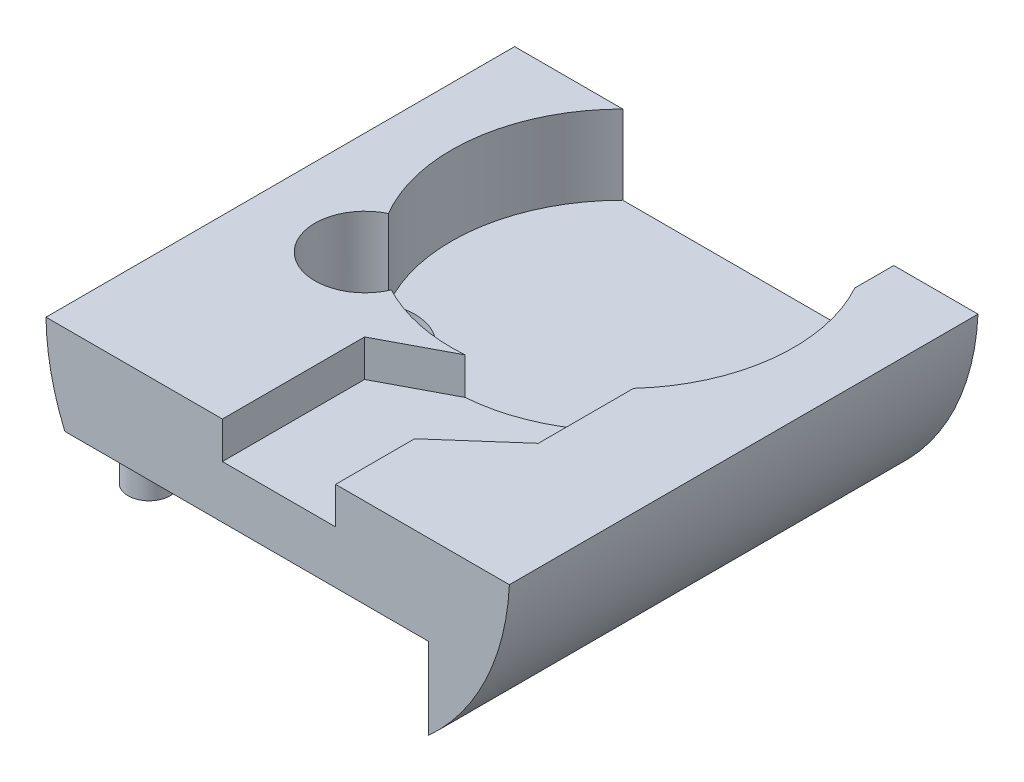
ISO-10303-21;
HEADER;
FILE_DESCRIPTION(('STEP AP214'),'2;1');
FILE_NAME('part.step','',(''),(''),'','','');
FILE_SCHEMA(('AUTOMOTIVE_DESIGN { 1 0 10303 214 1 1 1 1 }'));
ENDSEC;
DATA;
#1=APPLICATION_CONTEXT('core data for automotive mechanical design processes');
#2=APPLICATION_PROTOCOL_DEFINITION('international standard','automotive_design',2000,#1);
#3=PRODUCT_CONTEXT('',#1,'mechanical');
#4=PRODUCT('Part','Part','',(#3));
#5=PRODUCT_RELATED_PRODUCT_CATEGORY('part','',(#4));
#6=PRODUCT_DEFINITION_FORMATION('','',#4);
#7=PRODUCT_DEFINITION_CONTEXT('part definition',#1,'design');
#8=PRODUCT_DEFINITION('design','',#6,#7);
#9=PRODUCT_DEFINITION_SHAPE('','',#8);
#10=(LENGTH_UNIT() NAMED_UNIT(*) SI_UNIT(.MILLI.,.METRE.));
#11=(NAMED_UNIT(*) PLANE_ANGLE_UNIT() SI_UNIT($,.RADIAN.));
#12=(NAMED_UNIT(*) SI_UNIT($,.STERADIAN.) SOLID_ANGLE_UNIT());
#13=UNCERTAINTY_MEASURE_WITH_UNIT(LENGTH_MEASURE(1.E-05),#10,'distance_accuracy_value','');
#14=(GEOMETRIC_REPRESENTATION_CONTEXT(3) GLOBAL_UNCERTAINTY_ASSIGNED_CONTEXT((#13)) GLOBAL_UNIT_ASSIGNED_CONTEXT((#10,
#11,#12)) REPRESENTATION_CONTEXT('',''));
#15=CARTESIAN_POINT('',(0.,0.,0.));
#16=DIRECTION('',(0.,0.,1.));
#17=DIRECTION('',(1.,0.,0.));
#18=AXIS2_PLACEMENT_3D('',#15,#16,#17);
#19=CARTESIAN_POINT('',(0.115173737314581,37.,-24.));
#20=DIRECTION('',(0.,1.,0.));
#21=DIRECTION('',(0.,0.,1.));
#22=AXIS2_PLACEMENT_3D('',#19,#20,#21);
#23=PLANE('',#22);
#24=CARTESIAN_POINT('',(0.115173737314581,37.,-24.));
#25=DIRECTION('',(0.,1.,0.));
#26=DIRECTION('',(0.,0.,1.));
#27=AXIS2_PLACEMENT_3D('',#24,#25,#26);
#28=CIRCLE('',#27,32.5);
#29=CARTESIAN_POINT('',(2.61517373731457,37.,8.40370349203933));
#30=VERTEX_POINT('',#29);
#31=CARTESIAN_POINT('',(24.1151737373146,37.,-2.08539299918885));
#32=VERTEX_POINT('',#31);
#33=EDGE_CURVE('E166',#30,#32,#28,.T.);
#34=ORIENTED_EDGE('',*,*,#33,.F.);
#35=DIRECTION('',(-0.884411788148918,0.,0.466707391181276));
#36=VECTOR('',#35,1.);
#37=CARTESIAN_POINT('',(2.61517373731458,37.,8.40370349203932));
#38=LINE('',#37,#36);
#39=CARTESIAN_POINT('',(-9.88482626268543,37.,15.));
#40=VERTEX_POINT('',#39);
#41=EDGE_CURVE('E170',#30,#40,#38,.T.);
#42=ORIENTED_EDGE('',*,*,#41,.T.);
#43=DIRECTION('',(0.,0.,1.));
#44=VECTOR('',#43,1.);
#45=CARTESIAN_POINT('',(-9.88482626268543,37.,42.));
#46=LINE('',#45,#44);
#47=CARTESIAN_POINT('',(-9.88482626268543,37.,42.));
#48=VERTEX_POINT('',#47);
#49=EDGE_CURVE('E192',#40,#48,#46,.T.);
#50=ORIENTED_EDGE('',*,*,#49,.T.);
#51=DIRECTION('',(1.,0.,0.));
#52=VECTOR('',#51,1.);
#53=CARTESIAN_POINT('',(-9.88482626268543,37.,42.));
#54=LINE('',#53,#52);
#55=CARTESIAN_POINT('',(11.6151737373146,37.,42.));
#56=VERTEX_POINT('',#55);
#57=EDGE_CURVE('E195',#48,#56,#54,.T.);
#58=ORIENTED_EDGE('',*,*,#57,.T.);
#59=DIRECTION('',(0.,0.,-1.));
#60=VECTOR('',#59,1.);
#61=CARTESIAN_POINT('',(11.6151737373146,37.,42.));
#62=LINE('',#61,#60);
#63=CARTESIAN_POINT('',(11.6151737373146,37.,27.));
#64=VERTEX_POINT('',#63);
#65=EDGE_CURVE('E205',#56,#64,#62,.T.);
#66=ORIENTED_EDGE('',*,*,#65,.T.);
#67=DIRECTION('',(0.750713516922755,0.,-0.660627894892025));
#68=VECTOR('',#67,1.);
#69=CARTESIAN_POINT('',(24.1151737373146,37.,16.));
#70=LINE('',#69,#68);
#71=CARTESIAN_POINT('',(24.1151737373146,37.,16.));
#72=VERTEX_POINT('',#71);
#73=EDGE_CURVE('E208',#64,#72,#70,.T.);
#74=ORIENTED_EDGE('',*,*,#73,.T.);
#75=DIRECTION('',(0.,0.,-1.));
#76=VECTOR('',#75,1.);
#77=CARTESIAN_POINT('',(24.1151737373146,37.,16.));
#78=LINE('',#77,#76);
#79=EDGE_CURVE('E173',#72,#32,#78,.T.);
#80=ORIENTED_EDGE('',*,*,#79,.T.);
#81=EDGE_LOOP('',(#34,#42,#50,#58,#66,#74,#80));
#82=FACE_BOUND('',#81,.T.);
#83=ADVANCED_FACE('F39',(#82),#23,.T.);
#84=CARTESIAN_POINT('',(0.,44.,0.));
#85=DIRECTION('',(0.,-1.,0.));
#86=DIRECTION('',(0.,0.,-1.));
#87=AXIS2_PLACEMENT_3D('',#84,#85,#86);
#88=PLANE('',#87);
#89=DIRECTION('',(1.,0.,0.));
#90=VECTOR('',#89,1.);
#91=CARTESIAN_POINT('',(-39.934882495629,44.,-47.));
#92=LINE('',#91,#90);
#93=CARTESIAN_POINT('',(28.6151737373146,44.,-47.));
#94=VERTEX_POINT('',#93);
#95=CARTESIAN_POINT('',(44.6151737373146,44.,-47.));
#96=VERTEX_POINT('',#95);
#97=EDGE_CURVE('E305',#94,#96,#92,.T.);
#98=ORIENTED_EDGE('',*,*,#97,.F.);
#99=DIRECTION('',(0.,0.,-1.));
#100=VECTOR('',#99,1.);
#101=CARTESIAN_POINT('',(28.6151737373146,44.,-47.));
#102=LINE('',#101,#100);
#103=CARTESIAN_POINT('',(28.6151737373146,44.,-39.6204993518133));
#104=VERTEX_POINT('',#103);
#105=EDGE_CURVE('E193',#104,#94,#102,.T.);
#106=ORIENTED_EDGE('',*,*,#105,.F.);
#107=CARTESIAN_POINT('',(0.115173737314581,44.,-24.));
#108=DIRECTION('',(0.,1.,0.));
#109=DIRECTION('',(0.,0.,1.));
#110=AXIS2_PLACEMENT_3D('',#107,#108,#109);
#111=CIRCLE('',#110,32.5);
#112=CARTESIAN_POINT('',(24.1151737373146,44.,-2.08539299918885));
#113=VERTEX_POINT('',#112);
#114=EDGE_CURVE('E197',#113,#104,#111,.T.);
#115=ORIENTED_EDGE('',*,*,#114,.F.);
#116=DIRECTION('',(0.,0.,-1.));
#117=VECTOR('',#116,1.);
#118=CARTESIAN_POINT('',(24.1151737373146,44.,16.));
#119=LINE('',#118,#117);
#120=CARTESIAN_POINT('',(24.1151737373146,44.,16.));
#121=VERTEX_POINT('',#120);
#122=EDGE_CURVE('E225',#121,#113,#119,.T.);
#123=ORIENTED_EDGE('',*,*,#122,.F.);
#124=DIRECTION('',(0.750713516922755,0.,-0.660627894892025));
#125=VECTOR('',#124,1.);
#126=CARTESIAN_POINT('',(24.1151737373146,44.,16.));
#127=LINE('',#126,#125);
#128=CARTESIAN_POINT('',(11.6151737373146,44.,27.));
#129=VERTEX_POINT('',#128);
#130=EDGE_CURVE('E222',#129,#121,#127,.T.);
#131=ORIENTED_EDGE('',*,*,#130,.F.);
#132=DIRECTION('',(0.,0.,-1.));
#133=VECTOR('',#132,1.);
#134=CARTESIAN_POINT('',(11.6151737373146,44.,42.));
#135=LINE('',#134,#133);
#136=CARTESIAN_POINT('',(11.6151737373146,44.,42.));
#137=VERTEX_POINT('',#136);
#138=EDGE_CURVE('E219',#137,#129,#135,.T.);
#139=ORIENTED_EDGE('',*,*,#138,.F.);
#140=DIRECTION('',(1.,0.,0.));
#141=VECTOR('',#140,1.);
#142=CARTESIAN_POINT('',(-43.9760577315721,44.,42.));
#143=LINE('',#142,#141);
#144=CARTESIAN_POINT('',(44.6151737373146,44.,42.));
#145=VERTEX_POINT('',#144);
#146=EDGE_CURVE('E318',#137,#145,#143,.T.);
#147=ORIENTED_EDGE('',*,*,#146,.T.);
#148=DIRECTION('',(0.,0.,-1.));
#149=VECTOR('',#148,1.);
#150=CARTESIAN_POINT('',(44.6151737373146,44.,137.854055730574));
#151=LINE('',#150,#149);
#152=EDGE_CURVE('E302',#145,#96,#151,.T.);
#153=ORIENTED_EDGE('',*,*,#152,.T.);
#154=EDGE_LOOP('',(#98,#106,#115,#123,#131,#139,#147,#153));
#155=FACE_BOUND('',#154,.T.);
#156=ADVANCED_FACE('F382',(#155),#88,.F.);
#157=CARTESIAN_POINT('',(-43.9760577315721,44.,42.));
#158=DIRECTION('',(0.,0.,-1.));
#159=DIRECTION('',(-1.,0.,0.));
#160=AXIS2_PLACEMENT_3D('',#157,#158,#159);
#161=PLANE('',#160);
#162=ORIENTED_EDGE('',*,*,#146,.F.);
#163=DIRECTION('',(0.,1.,0.));
#164=VECTOR('',#163,1.);
#165=CARTESIAN_POINT('',(11.6151737373146,37.,42.));
#166=LINE('',#165,#164);
#167=EDGE_CURVE('E242',#56,#137,#166,.T.);
#168=ORIENTED_EDGE('',*,*,#167,.F.);
#169=ORIENTED_EDGE('',*,*,#57,.F.);
#170=DIRECTION('',(0.,1.,0.));
#171=VECTOR('',#170,1.);
#172=CARTESIAN_POINT('',(-9.88482626268543,37.,42.));
#173=LINE('',#172,#171);
#174=CARTESIAN_POINT('',(-9.88482626268543,44.,42.));
#175=VERTEX_POINT('',#174);
#176=EDGE_CURVE('E244',#48,#175,#173,.T.);
#177=ORIENTED_EDGE('',*,*,#176,.T.);
#178=CARTESIAN_POINT('',(-43.3848262626854,44.,42.));
#179=VERTEX_POINT('',#178);
#180=EDGE_CURVE('E63',#179,#175,#143,.T.);
#181=ORIENTED_EDGE('',*,*,#180,.F.);
#182=CARTESIAN_POINT('',(1.34416447326036,44.5241882281095,42.));
#183=DIRECTION('',(0.,0.,-1.));
#184=DIRECTION('',(-1.,0.,0.));
#185=AXIS2_PLACEMENT_3D('',#182,#183,#184);
#186=CIRCLE('',#185,44.7320621652391);
#187=CARTESIAN_POINT('',(-39.8123685743689,27.,42.));
#188=VERTEX_POINT('',#187);
#189=EDGE_CURVE('E299',#179,#188,#186,.F.);
#190=ORIENTED_EDGE('',*,*,#189,.T.);
#191=DIRECTION('',(-1.,0.,0.));
#192=VECTOR('',#191,1.);
#193=CARTESIAN_POINT('',(29.2533528876388,27.,42.));
#194=LINE('',#193,#192);
#195=CARTESIAN_POINT('',(29.2533528876388,27.,42.));
#196=VERTEX_POINT('',#195);
#197=EDGE_CURVE('E289',#196,#188,#194,.T.);
#198=ORIENTED_EDGE('',*,*,#197,.F.);
#199=DIRECTION('',(0.,-1.,0.));
#200=VECTOR('',#199,1.);
#201=CARTESIAN_POINT('',(29.2533528876388,27.,42.));
#202=LINE('',#201,#200);
#203=CARTESIAN_POINT('',(29.2533528876388,11.5294240693472,42.));
#204=VERTEX_POINT('',#203);
#205=EDGE_CURVE('E294',#196,#204,#202,.T.);
#206=ORIENTED_EDGE('',*,*,#205,.T.);
#207=CARTESIAN_POINT('',(-2.12996207837048,46.245986692911,42.));
#208=DIRECTION('',(0.,0.,-1.));
#209=DIRECTION('',(-1.,0.,0.));
#210=AXIS2_PLACEMENT_3D('',#207,#208,#209);
#211=CIRCLE('',#210,46.799061728325);
#212=EDGE_CURVE('E301',#204,#145,#211,.F.);
#213=ORIENTED_EDGE('',*,*,#212,.T.);
#214=EDGE_LOOP('',(#162,#168,#169,#177,#181,#190,#198,#206,#213));
#215=FACE_BOUND('',#214,.T.);
#216=ADVANCED_FACE('F41',(#215),#161,.F.);
#217=ORIENTED_EDGE('',*,*,#180,.T.);
#218=DIRECTION('',(0.,0.,1.));
#219=VECTOR('',#218,1.);
#220=CARTESIAN_POINT('',(-9.88482626268543,44.,42.));
#221=LINE('',#220,#219);
#222=CARTESIAN_POINT('',(-9.88482626268543,44.,15.));
#223=VERTEX_POINT('',#222);
#224=EDGE_CURVE('E217',#223,#175,#221,.T.);
#225=ORIENTED_EDGE('',*,*,#224,.F.);
#226=DIRECTION('',(-0.884411788148918,0.,0.466707391181276));
#227=VECTOR('',#226,1.);
#228=CARTESIAN_POINT('',(2.61517373731458,44.,8.40370349203932));
#229=LINE('',#228,#227);
#230=CARTESIAN_POINT('',(2.61517373731458,44.,8.40370349203932));
#231=VERTEX_POINT('',#230);
#232=EDGE_CURVE('E215',#231,#223,#229,.T.);
#233=ORIENTED_EDGE('',*,*,#232,.F.);
#234=CARTESIAN_POINT('',(0.115173737314581,44.,-24.));
#235=DIRECTION('',(0.,1.,0.));
#236=DIRECTION('',(0.,0.,1.));
#237=AXIS2_PLACEMENT_3D('',#234,#235,#236);
#238=CIRCLE('',#237,32.5);
#239=CARTESIAN_POINT('',(-15.0757908406014,44.,4.73124771381334));
#240=VERTEX_POINT('',#239);
#241=EDGE_CURVE('E183',#240,#231,#238,.T.);
#242=ORIENTED_EDGE('',*,*,#241,.F.);
#243=CARTESIAN_POINT('',(-23.8123685743689,44.,0.99999999999998));
#244=DIRECTION('',(0.,-1.,0.));
#245=DIRECTION('',(0.,0.,-1.));
#246=AXIS2_PLACEMENT_3D('',#243,#244,#245);
#247=CIRCLE('',#246,9.5);
#248=CARTESIAN_POINT('',(-27.9228480957396,44.,-7.56469252830435));
#249=VERTEX_POINT('',#248);
#250=EDGE_CURVE('E278',#240,#249,#247,.T.);
#251=ORIENTED_EDGE('',*,*,#250,.T.);
#252=CARTESIAN_POINT('',(-22.8467512690955,44.,-47.));
#253=VERTEX_POINT('',#252);
#254=EDGE_CURVE('E214',#253,#249,#238,.T.);
#255=ORIENTED_EDGE('',*,*,#254,.F.);
#256=CARTESIAN_POINT('',(-43.3848262626854,44.,-47.));
#257=VERTEX_POINT('',#256);
#258=EDGE_CURVE('E315',#257,#253,#92,.T.);
#259=ORIENTED_EDGE('',*,*,#258,.F.);
#260=DIRECTION('',(0.,0.,-1.));
#261=VECTOR('',#260,1.);
#262=CARTESIAN_POINT('',(-43.3848262626854,44.,137.854055730574));
#263=LINE('',#262,#261);
#264=EDGE_CURVE('E310',#179,#257,#263,.T.);
#265=ORIENTED_EDGE('',*,*,#264,.F.);
#266=EDGE_LOOP('',(#217,#225,#233,#242,#251,#255,#259,#265));
#267=FACE_BOUND('',#266,.T.);
#268=ADVANCED_FACE('F357',(#267),#88,.F.);
#269=CARTESIAN_POINT('',(-19.1343466552213,48.9563336411719,-47.));
#270=DIRECTION('',(0.,0.,-1.));
#271=DIRECTION('',(-1.,0.,0.));
#272=AXIS2_PLACEMENT_3D('',#269,#270,#271);
#273=PLANE('',#272);
#274=DIRECTION('',(0.,1.,0.));
#275=VECTOR('',#274,1.);
#276=CARTESIAN_POINT('',(-22.8467512690955,37.,-47.));
#277=LINE('',#276,#275);
#278=CARTESIAN_POINT('',(-22.8467512690955,29.,-47.));
#279=VERTEX_POINT('',#278);
#280=EDGE_CURVE('E248',#279,#253,#277,.T.);
#281=ORIENTED_EDGE('',*,*,#280,.F.);
#282=DIRECTION('',(1.,0.,0.));
#283=VECTOR('',#282,1.);
#284=CARTESIAN_POINT('',(-19.1343466552213,29.,-47.));
#285=LINE('',#284,#283);
#286=CARTESIAN_POINT('',(23.0770987437247,29.,-47.));
#287=VERTEX_POINT('',#286);
#288=EDGE_CURVE('E200',#279,#287,#285,.T.);
#289=ORIENTED_EDGE('',*,*,#288,.T.);
#290=DIRECTION('',(0.,1.,0.));
#291=VECTOR('',#290,1.);
#292=CARTESIAN_POINT('',(23.0770987437247,29.,-47.));
#293=LINE('',#292,#291);
#294=CARTESIAN_POINT('',(23.0770987437247,37.,-47.));
#295=VERTEX_POINT('',#294);
#296=EDGE_CURVE('E348',#295,#287,#293,.F.);
#297=ORIENTED_EDGE('',*,*,#296,.F.);
#298=DIRECTION('',(1.,0.,0.));
#299=VECTOR('',#298,1.);
#300=CARTESIAN_POINT('',(-19.1343466552213,37.,-47.));
#301=LINE('',#300,#299);
#302=CARTESIAN_POINT('',(28.6151737373146,37.,-47.));
#303=VERTEX_POINT('',#302);
#304=EDGE_CURVE('E233',#295,#303,#301,.T.);
#305=ORIENTED_EDGE('',*,*,#304,.T.);
#306=DIRECTION('',(0.,1.,0.));
#307=VECTOR('',#306,1.);
#308=CARTESIAN_POINT('',(28.6151737373146,37.,-47.));
#309=LINE('',#308,#307);
#310=EDGE_CURVE('E230',#303,#94,#309,.T.);
#311=ORIENTED_EDGE('',*,*,#310,.T.);
#312=ORIENTED_EDGE('',*,*,#97,.T.);
#313=CARTESIAN_POINT('',(-2.12996207837048,46.245986692911,-47.));
#314=DIRECTION('',(0.,0.,-1.));
#315=DIRECTION('',(1.,0.,0.));
#316=AXIS2_PLACEMENT_3D('',#313,#314,#315);
#317=CIRCLE('',#316,46.799061728325);
#318=CARTESIAN_POINT('',(29.2533528876388,11.5294240693472,-47.));
#319=VERTEX_POINT('',#318);
#320=EDGE_CURVE('E296',#96,#319,#317,.T.);
#321=ORIENTED_EDGE('',*,*,#320,.T.);
#322=DIRECTION('',(0.,-1.,0.));
#323=VECTOR('',#322,1.);
#324=CARTESIAN_POINT('',(29.2533528876389,27.,-47.));
#325=LINE('',#324,#323);
#326=CARTESIAN_POINT('',(29.2533528876389,27.,-47.));
#327=VERTEX_POINT('',#326);
#328=EDGE_CURVE('E54',#327,#319,#325,.T.);
#329=ORIENTED_EDGE('',*,*,#328,.F.);
#330=DIRECTION('',(1.,0.,0.));
#331=VECTOR('',#330,1.);
#332=CARTESIAN_POINT('',(29.2533528876389,27.,-47.));
#333=LINE('',#332,#331);
#334=CARTESIAN_POINT('',(-39.8123685743689,27.,-47.));
#335=VERTEX_POINT('',#334);
#336=EDGE_CURVE('E291',#335,#327,#333,.T.);
#337=ORIENTED_EDGE('',*,*,#336,.F.);
#338=CARTESIAN_POINT('',(1.34416447326036,44.5241882281095,-47.));
#339=DIRECTION('',(0.,0.,-1.));
#340=DIRECTION('',(-1.,0.,0.));
#341=AXIS2_PLACEMENT_3D('',#338,#339,#340);
#342=CIRCLE('',#341,44.7320621652391);
#343=EDGE_CURVE('E308',#335,#257,#342,.T.);
#344=ORIENTED_EDGE('',*,*,#343,.T.);
#345=ORIENTED_EDGE('',*,*,#258,.T.);
#346=EDGE_LOOP('',(#281,#289,#297,#305,#311,#312,#321,#329,#337,#344,#345));
#347=FACE_BOUND('',#346,.T.);
#348=ADVANCED_FACE('F351',(#347),#273,.T.);
#349=CARTESIAN_POINT('',(1.34416447326036,44.5241882281095,137.854055730574));
#350=DIRECTION('',(0.,0.,-1.));
#351=DIRECTION('',(-1.,0.,0.));
#352=AXIS2_PLACEMENT_3D('',#349,#350,#351);
#353=CYLINDRICAL_SURFACE('',#352,44.7320621652391);
#354=DIRECTION('',(0.,0.,-1.));
#355=VECTOR('',#354,1.);
#356=CARTESIAN_POINT('',(-39.8123685743689,27.,137.854055730574));
#357=LINE('',#356,#355);
#358=EDGE_CURVE('E281',#188,#335,#357,.T.);
#359=ORIENTED_EDGE('',*,*,#358,.F.);
#360=ORIENTED_EDGE('',*,*,#189,.F.);
#361=ORIENTED_EDGE('',*,*,#264,.T.);
#362=ORIENTED_EDGE('',*,*,#343,.F.);
#363=EDGE_LOOP('',(#359,#360,#361,#362));
#364=FACE_BOUND('',#363,.T.);
#365=ADVANCED_FACE('F413',(#364),#353,.T.);
#366=CARTESIAN_POINT('',(-2.12996207837048,46.245986692911,137.854055730574));
#367=DIRECTION('',(0.,0.,-1.));
#368=DIRECTION('',(-1.,0.,0.));
#369=AXIS2_PLACEMENT_3D('',#366,#367,#368);
#370=CYLINDRICAL_SURFACE('',#369,46.799061728325);
#371=DIRECTION('',(0.,0.,-1.));
#372=VECTOR('',#371,1.);
#373=CARTESIAN_POINT('',(29.2533528876388,11.5294240693471,137.854055730574));
#374=LINE('',#373,#372);
#375=EDGE_CURVE('E320',#319,#204,#374,.F.);
#376=ORIENTED_EDGE('',*,*,#375,.F.);
#377=ORIENTED_EDGE('',*,*,#320,.F.);
#378=ORIENTED_EDGE('',*,*,#152,.F.);
#379=ORIENTED_EDGE('',*,*,#212,.F.);
#380=EDGE_LOOP('',(#376,#377,#378,#379));
#381=FACE_BOUND('',#380,.T.);
#382=ADVANCED_FACE('F418',(#381),#370,.T.);
#383=CARTESIAN_POINT('',(29.2533528876388,27.,42.));
#384=DIRECTION('',(1.,0.,0.));
#385=DIRECTION('',(0.,0.,-1.));
#386=AXIS2_PLACEMENT_3D('',#383,#384,#385);
#387=PLANE('',#386);
#388=ORIENTED_EDGE('',*,*,#375,.T.);
#389=ORIENTED_EDGE('',*,*,#205,.F.);
#390=DIRECTION('',(0.,0.,1.));
#391=VECTOR('',#390,1.);
#392=CARTESIAN_POINT('',(29.2533528876388,27.,42.));
#393=LINE('',#392,#391);
#394=EDGE_CURVE('E286',#327,#196,#393,.T.);
#395=ORIENTED_EDGE('',*,*,#394,.F.);
#396=ORIENTED_EDGE('',*,*,#328,.T.);
#397=EDGE_LOOP('',(#388,#389,#395,#396));
#398=FACE_BOUND('',#397,.T.);
#399=ADVANCED_FACE('F423',(#398),#387,.F.);
#400=CARTESIAN_POINT('',(0.,27.,0.));
#401=DIRECTION('',(0.,1.,0.));
#402=DIRECTION('',(0.,0.,1.));
#403=AXIS2_PLACEMENT_3D('',#400,#401,#402);
#404=PLANE('',#403);
#405=CARTESIAN_POINT('',(-30.8123685743689,27.,-34.8));
#406=DIRECTION('',(0.,1.,0.));
#407=DIRECTION('',(0.,0.,1.));
#408=AXIS2_PLACEMENT_3D('',#405,#406,#407);
#409=CIRCLE('',#408,4.);
#410=CARTESIAN_POINT('',(-30.8123685743689,27.,-30.8));
#411=VERTEX_POINT('',#410);
#412=EDGE_CURVE('E328',#411,#411,#409,.F.);
#413=ORIENTED_EDGE('',*,*,#412,.F.);
#414=EDGE_LOOP('',(#413));
#415=FACE_BOUND('',#414,.T.);
#416=CARTESIAN_POINT('',(24.2533528876389,27.,-0.399999999999991));
#417=DIRECTION('',(0.,1.,0.));
#418=DIRECTION('',(0.,0.,1.));
#419=AXIS2_PLACEMENT_3D('',#416,#417,#418);
#420=CIRCLE('',#419,4.);
#421=CARTESIAN_POINT('',(24.2533528876389,27.,3.60000000000001));
#422=VERTEX_POINT('',#421);
#423=EDGE_CURVE('E325',#422,#422,#420,.F.);
#424=ORIENTED_EDGE('',*,*,#423,.F.);
#425=EDGE_LOOP('',(#424));
#426=FACE_BOUND('',#425,.T.);
#427=CARTESIAN_POINT('',(-28.7123685743689,27.,37.1));
#428=DIRECTION('',(0.,1.,0.));
#429=DIRECTION('',(0.,0.,1.));
#430=AXIS2_PLACEMENT_3D('',#427,#428,#429);
#431=CIRCLE('',#430,4.);
#432=CARTESIAN_POINT('',(-28.7123685743689,27.,41.1));
#433=VERTEX_POINT('',#432);
#434=EDGE_CURVE('E322',#433,#433,#431,.F.);
#435=ORIENTED_EDGE('',*,*,#434,.F.);
#436=EDGE_LOOP('',(#435));
#437=FACE_BOUND('',#436,.T.);
#438=CARTESIAN_POINT('',(-23.8123685743689,27.,0.99999999999998));
#439=DIRECTION('',(0.,-1.,0.));
#440=DIRECTION('',(0.,0.,-1.));
#441=AXIS2_PLACEMENT_3D('',#438,#439,#440);
#442=CIRCLE('',#441,9.5);
#443=CARTESIAN_POINT('',(-23.8123685743689,27.,-8.50000000000002));
#444=VERTEX_POINT('',#443);
#445=EDGE_CURVE('E277',#444,#444,#442,.T.);
#446=ORIENTED_EDGE('',*,*,#445,.F.);
#447=EDGE_LOOP('',(#446));
#448=FACE_BOUND('',#447,.T.);
#449=ORIENTED_EDGE('',*,*,#394,.T.);
#450=ORIENTED_EDGE('',*,*,#197,.T.);
#451=ORIENTED_EDGE('',*,*,#358,.T.);
#452=ORIENTED_EDGE('',*,*,#336,.T.);
#453=EDGE_LOOP('',(#449,#450,#451,#452));
#454=FACE_BOUND('',#453,.T.);
#455=ADVANCED_FACE('F428',(#415,#426,#437,#448,#454),#404,.F.);
#456=CARTESIAN_POINT('',(-23.8123685743689,44.,0.99999999999998));
#457=DIRECTION('',(0.,-1.,0.));
#458=DIRECTION('',(0.,0.,-1.));
#459=AXIS2_PLACEMENT_3D('',#456,#457,#458);
#460=CYLINDRICAL_SURFACE('',#459,9.5);
#461=DIRECTION('',(0.,1.,0.));
#462=VECTOR('',#461,1.);
#463=CARTESIAN_POINT('',(-15.0757908406014,40.5,4.73124771381333));
#464=LINE('',#463,#462);
#465=CARTESIAN_POINT('',(-15.0757908406014,29.,4.73124771381334));
#466=VERTEX_POINT('',#465);
#467=EDGE_CURVE('E47',#240,#466,#464,.F.);
#468=ORIENTED_EDGE('',*,*,#467,.T.);
#469=CARTESIAN_POINT('',(-23.8123685743689,29.,0.99999999999998));
#470=DIRECTION('',(0.,1.,0.));
#471=DIRECTION('',(0.,0.,1.));
#472=AXIS2_PLACEMENT_3D('',#469,#470,#471);
#473=CIRCLE('',#472,9.5);
#474=CARTESIAN_POINT('',(-27.9228480957397,29.,-7.56469252830434));
#475=VERTEX_POINT('',#474);
#476=EDGE_CURVE('E11',#475,#466,#473,.F.);
#477=ORIENTED_EDGE('',*,*,#476,.F.);
#478=DIRECTION('',(0.,1.,0.));
#479=VECTOR('',#478,1.);
#480=CARTESIAN_POINT('',(-27.9228480957396,40.5,-7.56469252830434));
#481=LINE('',#480,#479);
#482=EDGE_CURVE('E331',#475,#249,#481,.T.);
#483=ORIENTED_EDGE('',*,*,#482,.T.);
#484=ORIENTED_EDGE('',*,*,#250,.F.);
#485=EDGE_LOOP('',(#468,#477,#483,#484));
#486=FACE_BOUND('',#485,.T.);
#487=ORIENTED_EDGE('',*,*,#445,.T.);
#488=EDGE_LOOP('',(#487));
#489=FACE_BOUND('',#488,.T.);
#490=ADVANCED_FACE('F336',(#486,#489),#460,.F.);
#491=CARTESIAN_POINT('',(-28.7123685743689,21.5,37.1));
#492=DIRECTION('',(0.,-1.,0.));
#493=DIRECTION('',(0.,0.,-1.));
#494=AXIS2_PLACEMENT_3D('',#491,#492,#493);
#495=PLANE('',#494);
#496=CARTESIAN_POINT('',(-28.7123685743689,21.5,37.1));
#497=DIRECTION('',(0.,-1.,0.));
#498=DIRECTION('',(0.,0.,-1.));
#499=AXIS2_PLACEMENT_3D('',#496,#497,#498);
#500=CIRCLE('',#499,4.);
#501=CARTESIAN_POINT('',(-28.7123685743689,21.5,33.1));
#502=VERTEX_POINT('',#501);
#503=EDGE_CURVE('E272',#502,#502,#500,.T.);
#504=ORIENTED_EDGE('',*,*,#503,.T.);
#505=EDGE_LOOP('',(#504));
#506=FACE_BOUND('',#505,.T.);
#507=CARTESIAN_POINT('',(-28.7123685743689,21.5,37.1));
#508=DIRECTION('',(0.,-1.,0.));
#509=DIRECTION('',(0.,0.,-1.));
#510=AXIS2_PLACEMENT_3D('',#507,#508,#509);
#511=CIRCLE('',#510,1.5);
#512=CARTESIAN_POINT('',(-28.7123685743689,21.5,35.6));
#513=VERTEX_POINT('',#512);
#514=EDGE_CURVE('E269',#513,#513,#511,.T.);
#515=ORIENTED_EDGE('',*,*,#514,.F.);
#516=EDGE_LOOP('',(#515));
#517=FACE_BOUND('',#516,.T.);
#518=ADVANCED_FACE('F435',(#506,#517),#495,.T.);
#519=CARTESIAN_POINT('',(-28.7123685743689,21.5,37.1));
#520=DIRECTION('',(0.,1.,0.));
#521=DIRECTION('',(0.,0.,1.));
#522=AXIS2_PLACEMENT_3D('',#519,#520,#521);
#523=CYLINDRICAL_SURFACE('',#522,4.);
#524=ORIENTED_EDGE('',*,*,#503,.F.);
#525=EDGE_LOOP('',(#524));
#526=FACE_BOUND('',#525,.T.);
#527=ORIENTED_EDGE('',*,*,#434,.T.);
#528=EDGE_LOOP('',(#527));
#529=FACE_BOUND('',#528,.T.);
#530=ADVANCED_FACE('F436',(#526,#529),#523,.T.);
#531=CARTESIAN_POINT('',(-28.7123685743689,21.5,37.1));
#532=DIRECTION('',(0.,1.,0.));
#533=DIRECTION('',(0.,0.,1.));
#534=AXIS2_PLACEMENT_3D('',#531,#532,#533);
#535=CYLINDRICAL_SURFACE('',#534,1.5);
#536=ORIENTED_EDGE('',*,*,#514,.T.);
#537=EDGE_LOOP('',(#536));
#538=FACE_BOUND('',#537,.T.);
#539=CARTESIAN_POINT('',(-28.7123685743689,27.,37.1));
#540=DIRECTION('',(0.,-1.,0.));
#541=DIRECTION('',(0.,0.,-1.));
#542=AXIS2_PLACEMENT_3D('',#539,#540,#541);
#543=CIRCLE('',#542,1.5);
#544=CARTESIAN_POINT('',(-28.7123685743689,27.,35.6));
#545=VERTEX_POINT('',#544);
#546=EDGE_CURVE('E268',#545,#545,#543,.T.);
#547=ORIENTED_EDGE('',*,*,#546,.F.);
#548=EDGE_LOOP('',(#547));
#549=FACE_BOUND('',#548,.T.);
#550=ADVANCED_FACE('F439',(#538,#549),#535,.F.);
#551=ORIENTED_EDGE('',*,*,#546,.T.);
#552=EDGE_LOOP('',(#551));
#553=FACE_BOUND('',#552,.T.);
#554=ADVANCED_FACE('F433',(#553),#404,.F.);
#555=CARTESIAN_POINT('',(24.2533528876389,21.5,-0.399999999999991));
#556=DIRECTION('',(0.,-1.,0.));
#557=DIRECTION('',(0.,0.,-1.));
#558=AXIS2_PLACEMENT_3D('',#555,#556,#557);
#559=PLANE('',#558);
#560=CARTESIAN_POINT('',(24.2533528876389,21.5,-0.399999999999991));
#561=DIRECTION('',(0.,-1.,0.));
#562=DIRECTION('',(0.,0.,-1.));
#563=AXIS2_PLACEMENT_3D('',#560,#561,#562);
#564=CIRCLE('',#563,4.);
#565=CARTESIAN_POINT('',(24.2533528876389,21.5,-4.39999999999999));
#566=VERTEX_POINT('',#565);
#567=EDGE_CURVE('E263',#566,#566,#564,.T.);
#568=ORIENTED_EDGE('',*,*,#567,.T.);
#569=EDGE_LOOP('',(#568));
#570=FACE_BOUND('',#569,.T.);
#571=CARTESIAN_POINT('',(24.2533528876389,21.5,-0.399999999999991));
#572=DIRECTION('',(0.,-1.,0.));
#573=DIRECTION('',(0.,0.,-1.));
#574=AXIS2_PLACEMENT_3D('',#571,#572,#573);
#575=CIRCLE('',#574,1.5);
#576=CARTESIAN_POINT('',(24.2533528876389,21.5,-1.89999999999999));
#577=VERTEX_POINT('',#576);
#578=EDGE_CURVE('E260',#577,#577,#575,.T.);
#579=ORIENTED_EDGE('',*,*,#578,.F.);
#580=EDGE_LOOP('',(#579));
#581=FACE_BOUND('',#580,.T.);
#582=ADVANCED_FACE('F450',(#570,#581),#559,.T.);
#583=CARTESIAN_POINT('',(24.2533528876389,21.5,-0.399999999999991));
#584=DIRECTION('',(0.,1.,0.));
#585=DIRECTION('',(0.,0.,1.));
#586=AXIS2_PLACEMENT_3D('',#583,#584,#585);
#587=CYLINDRICAL_SURFACE('',#586,4.);
#588=ORIENTED_EDGE('',*,*,#567,.F.);
#589=EDGE_LOOP('',(#588));
#590=FACE_BOUND('',#589,.T.);
#591=ORIENTED_EDGE('',*,*,#423,.T.);
#592=EDGE_LOOP('',(#591));
#593=FACE_BOUND('',#592,.T.);
#594=ADVANCED_FACE('F446',(#590,#593),#587,.T.);
#595=CARTESIAN_POINT('',(24.2533528876389,21.5,-0.399999999999991));
#596=DIRECTION('',(0.,1.,0.));
#597=DIRECTION('',(0.,0.,1.));
#598=AXIS2_PLACEMENT_3D('',#595,#596,#597);
#599=CYLINDRICAL_SURFACE('',#598,1.5);
#600=ORIENTED_EDGE('',*,*,#578,.T.);
#601=EDGE_LOOP('',(#600));
#602=FACE_BOUND('',#601,.T.);
#603=CARTESIAN_POINT('',(24.2533528876389,27.,-0.399999999999991));
#604=DIRECTION('',(0.,-1.,0.));
#605=DIRECTION('',(0.,0.,-1.));
#606=AXIS2_PLACEMENT_3D('',#603,#604,#605);
#607=CIRCLE('',#606,1.5);
#608=CARTESIAN_POINT('',(24.2533528876389,27.,-1.89999999999999));
#609=VERTEX_POINT('',#608);
#610=EDGE_CURVE('E259',#609,#609,#607,.T.);
#611=ORIENTED_EDGE('',*,*,#610,.F.);
#612=EDGE_LOOP('',(#611));
#613=FACE_BOUND('',#612,.T.);
#614=ADVANCED_FACE('F449',(#602,#613),#599,.F.);
#615=ORIENTED_EDGE('',*,*,#610,.T.);
#616=EDGE_LOOP('',(#615));
#617=FACE_BOUND('',#616,.T.);
#618=ADVANCED_FACE('F457',(#617),#404,.F.);
#619=CARTESIAN_POINT('',(-30.8123685743689,21.5,-34.8));
#620=DIRECTION('',(0.,-1.,0.));
#621=DIRECTION('',(0.,0.,-1.));
#622=AXIS2_PLACEMENT_3D('',#619,#620,#621);
#623=PLANE('',#622);
#624=CARTESIAN_POINT('',(-30.8123685743689,21.5,-34.8));
#625=DIRECTION('',(0.,-1.,0.));
#626=DIRECTION('',(0.,0.,-1.));
#627=AXIS2_PLACEMENT_3D('',#624,#625,#626);
#628=CIRCLE('',#627,4.);
#629=CARTESIAN_POINT('',(-30.8123685743689,21.5,-38.8));
#630=VERTEX_POINT('',#629);
#631=EDGE_CURVE('E254',#630,#630,#628,.T.);
#632=ORIENTED_EDGE('',*,*,#631,.T.);
#633=EDGE_LOOP('',(#632));
#634=FACE_BOUND('',#633,.T.);
#635=CARTESIAN_POINT('',(-30.8123685743689,21.5,-34.8));
#636=DIRECTION('',(0.,-1.,0.));
#637=DIRECTION('',(0.,0.,-1.));
#638=AXIS2_PLACEMENT_3D('',#635,#636,#637);
#639=CIRCLE('',#638,1.5);
#640=CARTESIAN_POINT('',(-30.8123685743689,21.5,-36.3));
#641=VERTEX_POINT('',#640);
#642=EDGE_CURVE('E251',#641,#641,#639,.T.);
#643=ORIENTED_EDGE('',*,*,#642,.F.);
#644=EDGE_LOOP('',(#643));
#645=FACE_BOUND('',#644,.T.);
#646=ADVANCED_FACE('F463',(#634,#645),#623,.T.);
#647=CARTESIAN_POINT('',(-30.8123685743689,21.5,-34.8));
#648=DIRECTION('',(0.,1.,0.));
#649=DIRECTION('',(0.,0.,1.));
#650=AXIS2_PLACEMENT_3D('',#647,#648,#649);
#651=CYLINDRICAL_SURFACE('',#650,4.);
#652=ORIENTED_EDGE('',*,*,#631,.F.);
#653=EDGE_LOOP('',(#652));
#654=FACE_BOUND('',#653,.T.);
#655=ORIENTED_EDGE('',*,*,#412,.T.);
#656=EDGE_LOOP('',(#655));
#657=FACE_BOUND('',#656,.T.);
#658=ADVANCED_FACE('F459',(#654,#657),#651,.T.);
#659=CARTESIAN_POINT('',(-30.8123685743689,21.5,-34.8));
#660=DIRECTION('',(0.,1.,0.));
#661=DIRECTION('',(0.,0.,1.));
#662=AXIS2_PLACEMENT_3D('',#659,#660,#661);
#663=CYLINDRICAL_SURFACE('',#662,1.5);
#664=ORIENTED_EDGE('',*,*,#642,.T.);
#665=EDGE_LOOP('',(#664));
#666=FACE_BOUND('',#665,.T.);
#667=CARTESIAN_POINT('',(-30.8123685743689,27.,-34.8));
#668=DIRECTION('',(0.,-1.,0.));
#669=DIRECTION('',(0.,0.,-1.));
#670=AXIS2_PLACEMENT_3D('',#667,#668,#669);
#671=CIRCLE('',#670,1.5);
#672=CARTESIAN_POINT('',(-30.8123685743689,27.,-36.3));
#673=VERTEX_POINT('',#672);
#674=EDGE_CURVE('E250',#673,#673,#671,.T.);
#675=ORIENTED_EDGE('',*,*,#674,.F.);
#676=EDGE_LOOP('',(#675));
#677=FACE_BOUND('',#676,.T.);
#678=ADVANCED_FACE('F462',(#666,#677),#663,.F.);
#679=ORIENTED_EDGE('',*,*,#674,.T.);
#680=EDGE_LOOP('',(#679));
#681=FACE_BOUND('',#680,.T.);
#682=ADVANCED_FACE('F432',(#681),#404,.F.);
#683=CARTESIAN_POINT('',(0.115173737314581,37.,-24.));
#684=DIRECTION('',(0.,1.,0.));
#685=DIRECTION('',(0.,0.,1.));
#686=AXIS2_PLACEMENT_3D('',#683,#684,#685);
#687=CYLINDRICAL_SURFACE('',#686,32.5);
#688=ORIENTED_EDGE('',*,*,#241,.T.);
#689=DIRECTION('',(0.,1.,0.));
#690=VECTOR('',#689,1.);
#691=CARTESIAN_POINT('',(2.61517373731458,37.,8.40370349203932));
#692=LINE('',#691,#690);
#693=EDGE_CURVE('E180',#30,#231,#692,.T.);
#694=ORIENTED_EDGE('',*,*,#693,.F.);
#695=ORIENTED_EDGE('',*,*,#33,.T.);
#696=DIRECTION('',(0.,1.,0.));
#697=VECTOR('',#696,1.);
#698=CARTESIAN_POINT('',(24.1151737373146,37.,-2.08539299918885));
#699=LINE('',#698,#697);
#700=EDGE_CURVE('E236',#32,#113,#699,.T.);
#701=ORIENTED_EDGE('',*,*,#700,.T.);
#702=ORIENTED_EDGE('',*,*,#114,.T.);
#703=DIRECTION('',(0.,1.,0.));
#704=VECTOR('',#703,1.);
#705=CARTESIAN_POINT('',(28.6151737373146,37.,-39.6204993518133));
#706=LINE('',#705,#704);
#707=CARTESIAN_POINT('',(28.6151737373146,37.,-39.6204993518133));
#708=VERTEX_POINT('',#707);
#709=EDGE_CURVE('E234',#708,#104,#706,.T.);
#710=ORIENTED_EDGE('',*,*,#709,.F.);
#711=EDGE_CURVE('E177',#708,#295,#28,.T.);
#712=ORIENTED_EDGE('',*,*,#711,.T.);
#713=ORIENTED_EDGE('',*,*,#296,.T.);
#714=CARTESIAN_POINT('',(0.115173737314581,29.,-24.));
#715=DIRECTION('',(0.,1.,0.));
#716=DIRECTION('',(0.,0.,1.));
#717=AXIS2_PLACEMENT_3D('',#714,#715,#716);
#718=CIRCLE('',#717,32.5);
#719=EDGE_CURVE('E176',#466,#287,#718,.T.);
#720=ORIENTED_EDGE('',*,*,#719,.F.);
#721=ORIENTED_EDGE('',*,*,#467,.F.);
#722=EDGE_LOOP('',(#688,#694,#695,#701,#702,#710,#712,#713,#720,#721));
#723=FACE_BOUND('',#722,.T.);
#724=ADVANCED_FACE('F181',(#723),#687,.F.);
#725=ORIENTED_EDGE('',*,*,#280,.T.);
#726=ORIENTED_EDGE('',*,*,#254,.T.);
#727=ORIENTED_EDGE('',*,*,#482,.F.);
#728=EDGE_CURVE('E346',#279,#475,#718,.T.);
#729=ORIENTED_EDGE('',*,*,#728,.F.);
#730=EDGE_LOOP('',(#725,#726,#727,#729));
#731=FACE_BOUND('',#730,.T.);
#732=ADVANCED_FACE('F354',(#731),#687,.F.);
#733=ORIENTED_EDGE('',*,*,#711,.F.);
#734=DIRECTION('',(0.,0.,-1.));
#735=VECTOR('',#734,1.);
#736=CARTESIAN_POINT('',(28.6151737373146,37.,-47.));
#737=LINE('',#736,#735);
#738=EDGE_CURVE('E188',#708,#303,#737,.T.);
#739=ORIENTED_EDGE('',*,*,#738,.T.);
#740=ORIENTED_EDGE('',*,*,#304,.F.);
#741=EDGE_LOOP('',(#733,#739,#740));
#742=FACE_BOUND('',#741,.T.);
#743=ADVANCED_FACE('F387',(#742),#23,.T.);
#744=CARTESIAN_POINT('',(28.6151737373146,37.,-47.));
#745=DIRECTION('',(1.,0.,0.));
#746=DIRECTION('',(0.,0.,-1.));
#747=AXIS2_PLACEMENT_3D('',#744,#745,#746);
#748=PLANE('',#747);
#749=ORIENTED_EDGE('',*,*,#105,.T.);
#750=ORIENTED_EDGE('',*,*,#310,.F.);
#751=ORIENTED_EDGE('',*,*,#738,.F.);
#752=ORIENTED_EDGE('',*,*,#709,.T.);
#753=EDGE_LOOP('',(#749,#750,#751,#752));
#754=FACE_BOUND('',#753,.T.);
#755=ADVANCED_FACE('F385',(#754),#748,.F.);
#756=CARTESIAN_POINT('',(24.1151737373146,37.,16.));
#757=DIRECTION('',(1.,0.,0.));
#758=DIRECTION('',(0.,0.,-1.));
#759=AXIS2_PLACEMENT_3D('',#756,#757,#758);
#760=PLANE('',#759);
#761=ORIENTED_EDGE('',*,*,#122,.T.);
#762=ORIENTED_EDGE('',*,*,#700,.F.);
#763=ORIENTED_EDGE('',*,*,#79,.F.);
#764=DIRECTION('',(0.,1.,0.));
#765=VECTOR('',#764,1.);
#766=CARTESIAN_POINT('',(24.1151737373146,37.,16.));
#767=LINE('',#766,#765);
#768=EDGE_CURVE('E238',#72,#121,#767,.T.);
#769=ORIENTED_EDGE('',*,*,#768,.T.);
#770=EDGE_LOOP('',(#761,#762,#763,#769));
#771=FACE_BOUND('',#770,.T.);
#772=ADVANCED_FACE('F375',(#771),#760,.F.);
#773=CARTESIAN_POINT('',(24.1151737373146,37.,16.));
#774=DIRECTION('',(0.660627894892025,0.,0.750713516922755));
#775=DIRECTION('',(0.750713516922755,0.,-0.660627894892025));
#776=AXIS2_PLACEMENT_3D('',#773,#774,#775);
#777=PLANE('',#776);
#778=ORIENTED_EDGE('',*,*,#130,.T.);
#779=ORIENTED_EDGE('',*,*,#768,.F.);
#780=ORIENTED_EDGE('',*,*,#73,.F.);
#781=DIRECTION('',(0.,1.,0.));
#782=VECTOR('',#781,1.);
#783=CARTESIAN_POINT('',(11.6151737373146,37.,27.));
#784=LINE('',#783,#782);
#785=EDGE_CURVE('E240',#64,#129,#784,.T.);
#786=ORIENTED_EDGE('',*,*,#785,.T.);
#787=EDGE_LOOP('',(#778,#779,#780,#786));
#788=FACE_BOUND('',#787,.T.);
#789=ADVANCED_FACE('F372',(#788),#777,.F.);
#790=CARTESIAN_POINT('',(11.6151737373146,37.,42.));
#791=DIRECTION('',(1.,0.,0.));
#792=DIRECTION('',(0.,0.,-1.));
#793=AXIS2_PLACEMENT_3D('',#790,#791,#792);
#794=PLANE('',#793);
#795=ORIENTED_EDGE('',*,*,#138,.T.);
#796=ORIENTED_EDGE('',*,*,#785,.F.);
#797=ORIENTED_EDGE('',*,*,#65,.F.);
#798=ORIENTED_EDGE('',*,*,#167,.T.);
#799=EDGE_LOOP('',(#795,#796,#797,#798));
#800=FACE_BOUND('',#799,.T.);
#801=ADVANCED_FACE('F368',(#800),#794,.F.);
#802=CARTESIAN_POINT('',(-9.88482626268543,37.,42.));
#803=DIRECTION('',(-1.,0.,0.));
#804=DIRECTION('',(0.,0.,1.));
#805=AXIS2_PLACEMENT_3D('',#802,#803,#804);
#806=PLANE('',#805);
#807=ORIENTED_EDGE('',*,*,#224,.T.);
#808=ORIENTED_EDGE('',*,*,#176,.F.);
#809=ORIENTED_EDGE('',*,*,#49,.F.);
#810=DIRECTION('',(0.,1.,0.));
#811=VECTOR('',#810,1.);
#812=CARTESIAN_POINT('',(-9.88482626268543,37.,15.));
#813=LINE('',#812,#811);
#814=EDGE_CURVE('E187',#40,#223,#813,.T.);
#815=ORIENTED_EDGE('',*,*,#814,.T.);
#816=EDGE_LOOP('',(#807,#808,#809,#815));
#817=FACE_BOUND('',#816,.T.);
#818=ADVANCED_FACE('F362',(#817),#806,.F.);
#819=CARTESIAN_POINT('',(2.61517373731458,37.,8.40370349203932));
#820=DIRECTION('',(-0.466707391181276,0.,-0.884411788148918));
#821=DIRECTION('',(-0.884411788148918,0.,0.466707391181276));
#822=AXIS2_PLACEMENT_3D('',#819,#820,#821);
#823=PLANE('',#822);
#824=ORIENTED_EDGE('',*,*,#232,.T.);
#825=ORIENTED_EDGE('',*,*,#814,.F.);
#826=ORIENTED_EDGE('',*,*,#41,.F.);
#827=ORIENTED_EDGE('',*,*,#693,.T.);
#828=EDGE_LOOP('',(#824,#825,#826,#827));
#829=FACE_BOUND('',#828,.T.);
#830=ADVANCED_FACE('F190',(#829),#823,.F.);
#831=CARTESIAN_POINT('',(0.115173737314581,29.,-24.));
#832=DIRECTION('',(0.,1.,0.));
#833=DIRECTION('',(0.,0.,1.));
#834=AXIS2_PLACEMENT_3D('',#831,#832,#833);
#835=PLANE('',#834);
#836=ORIENTED_EDGE('',*,*,#728,.T.);
#837=ORIENTED_EDGE('',*,*,#476,.T.);
#838=ORIENTED_EDGE('',*,*,#719,.T.);
#839=ORIENTED_EDGE('',*,*,#288,.F.);
#840=EDGE_LOOP('',(#836,#837,#838,#839));
#841=FACE_BOUND('',#840,.T.);
#842=ADVANCED_FACE('F342',(#841),#835,.T.);
#843=CLOSED_SHELL('',(#83,#156,#216,#268,#348,#365,#382,#399,#455,#490,#518,#530,#550,#554,#582,
#594,#614,#618,#646,#658,#678,#682,#724,#732,#743,#755,#772,#789,#801,#818,#830,#842));
#844=MANIFOLD_SOLID_BREP('B2',#843);
#845=ADVANCED_BREP_SHAPE_REPRESENTATION('',(#18,#844),#14);
#846=SHAPE_DEFINITION_REPRESENTATION(#9,#845);
ENDSEC;
END-ISO-10303-21;
